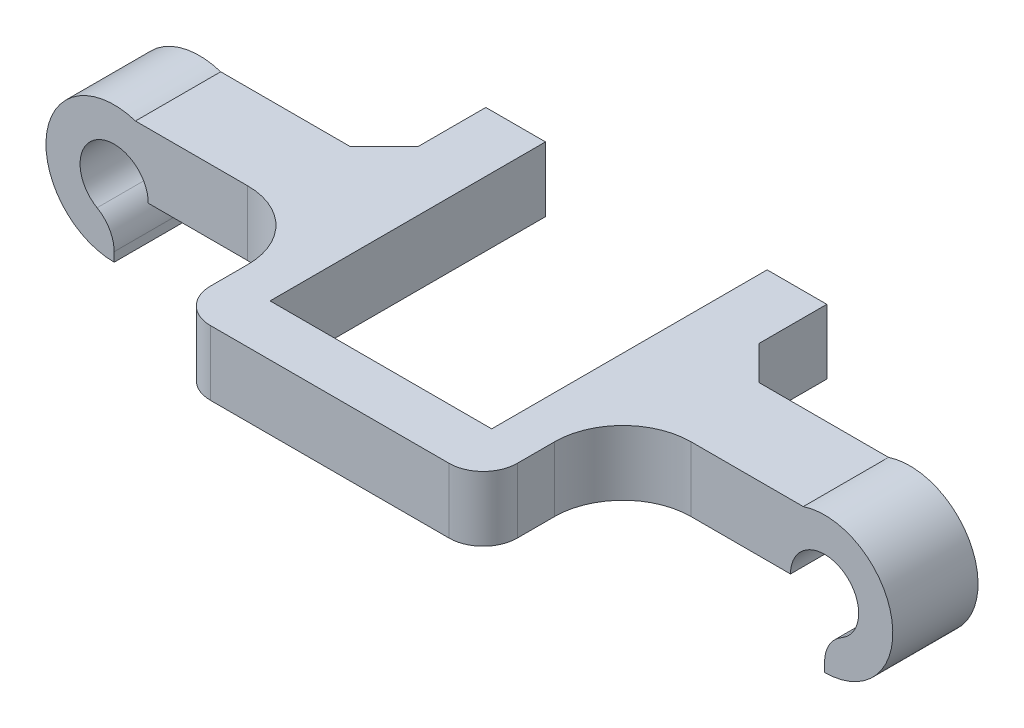
ISO-10303-21;
HEADER;
FILE_DESCRIPTION(('STEP AP214'),'2;1');
FILE_NAME('part.step','',(''),(''),'','','');
FILE_SCHEMA(('AUTOMOTIVE_DESIGN { 1 0 10303 214 1 1 1 1 }'));
ENDSEC;
DATA;
#1=APPLICATION_CONTEXT('core data for automotive mechanical design processes');
#2=APPLICATION_PROTOCOL_DEFINITION('international standard','automotive_design',2000,#1);
#3=PRODUCT_CONTEXT('',#1,'mechanical');
#4=PRODUCT('Part','Part','',(#3));
#5=PRODUCT_RELATED_PRODUCT_CATEGORY('part','',(#4));
#6=PRODUCT_DEFINITION_FORMATION('','',#4);
#7=PRODUCT_DEFINITION_CONTEXT('part definition',#1,'design');
#8=PRODUCT_DEFINITION('design','',#6,#7);
#9=PRODUCT_DEFINITION_SHAPE('','',#8);
#10=(LENGTH_UNIT() NAMED_UNIT(*) SI_UNIT(.MILLI.,.METRE.));
#11=(NAMED_UNIT(*) PLANE_ANGLE_UNIT() SI_UNIT($,.RADIAN.));
#12=(NAMED_UNIT(*) SI_UNIT($,.STERADIAN.) SOLID_ANGLE_UNIT());
#13=UNCERTAINTY_MEASURE_WITH_UNIT(LENGTH_MEASURE(1.E-05),#10,'distance_accuracy_value','');
#14=(GEOMETRIC_REPRESENTATION_CONTEXT(3) GLOBAL_UNCERTAINTY_ASSIGNED_CONTEXT((#13)) GLOBAL_UNIT_ASSIGNED_CONTEXT((#10,
#11,#12)) REPRESENTATION_CONTEXT('',''));
#15=CARTESIAN_POINT('',(0.,0.,0.));
#16=DIRECTION('',(0.,0.,1.));
#17=DIRECTION('',(1.,0.,0.));
#18=AXIS2_PLACEMENT_3D('',#15,#16,#17);
#19=CARTESIAN_POINT('',(72.7520899639895,20.4324888894581,28.));
#20=DIRECTION('',(1.,0.,0.));
#21=DIRECTION('',(0.,0.,-1.));
#22=AXIS2_PLACEMENT_3D('',#19,#20,#21);
#23=PLANE('',#22);
#24=DIRECTION('',(0.,1.,0.));
#25=VECTOR('',#24,1.);
#26=CARTESIAN_POINT('',(72.7520899639895,20.4324888894581,11.6620993138757));
#27=LINE('',#26,#25);
#28=CARTESIAN_POINT('',(72.7520899639895,18.4324888894581,11.6620993138757));
#29=VERTEX_POINT('',#28);
#30=CARTESIAN_POINT('',(72.7520899639895,18.9683872743203,11.6620993138757));
#31=VERTEX_POINT('',#30);
#32=EDGE_CURVE('E310',#29,#31,#27,.T.);
#33=ORIENTED_EDGE('',*,*,#32,.F.);
#34=DIRECTION('',(0.,0.,-1.));
#35=VECTOR('',#34,1.);
#36=CARTESIAN_POINT('',(72.7520899639895,18.4324888894581,28.));
#37=LINE('',#36,#35);
#38=CARTESIAN_POINT('',(72.7520899639895,18.4324888894581,16.6620993138757));
#39=VERTEX_POINT('',#38);
#40=EDGE_CURVE('E345',#39,#29,#37,.T.);
#41=ORIENTED_EDGE('',*,*,#40,.F.);
#42=DIRECTION('',(0.,-1.,0.));
#43=VECTOR('',#42,1.);
#44=CARTESIAN_POINT('',(72.7520899639895,20.4324888894581,16.6620993138757));
#45=LINE('',#44,#43);
#46=CARTESIAN_POINT('',(72.7520899639895,18.9683872743203,16.6620993138757));
#47=VERTEX_POINT('',#46);
#48=EDGE_CURVE('E297',#47,#39,#45,.T.);
#49=ORIENTED_EDGE('',*,*,#48,.F.);
#50=DIRECTION('',(0.,0.,-1.));
#51=VECTOR('',#50,1.);
#52=CARTESIAN_POINT('',(72.7520899639895,18.9683872743203,28.));
#53=LINE('',#52,#51);
#54=EDGE_CURVE('E348',#47,#31,#53,.T.);
#55=ORIENTED_EDGE('',*,*,#54,.T.);
#56=EDGE_LOOP('',(#33,#41,#49,#55));
#57=FACE_BOUND('',#56,.T.);
#58=ADVANCED_FACE('F36',(#57),#23,.F.);
#59=CARTESIAN_POINT('',(72.7520899639895,22.4324888894581,28.));
#60=DIRECTION('',(0.,0.,-1.));
#61=DIRECTION('',(-1.,0.,0.));
#62=AXIS2_PLACEMENT_3D('',#59,#60,#61);
#63=CYLINDRICAL_SURFACE('',#62,4.);
#64=ORIENTED_EDGE('',*,*,#40,.T.);
#65=CARTESIAN_POINT('',(72.7520899639895,22.4324888894581,11.6620993138757));
#66=DIRECTION('',(0.,0.,-1.));
#67=DIRECTION('',(-1.,0.,0.));
#68=AXIS2_PLACEMENT_3D('',#65,#66,#67);
#69=CIRCLE('',#68,4.);
#70=CARTESIAN_POINT('',(71.5030903642794,26.2324888894481,11.6620993138757));
#71=VERTEX_POINT('',#70);
#72=EDGE_CURVE('E312',#71,#29,#69,.T.);
#73=ORIENTED_EDGE('',*,*,#72,.F.);
#74=DIRECTION('',(0.,0.,-1.));
#75=VECTOR('',#74,1.);
#76=CARTESIAN_POINT('',(71.5030903643098,26.2324888894581,28.));
#77=LINE('',#76,#75);
#78=CARTESIAN_POINT('',(71.5030903642794,26.2324888894481,16.6620993138757));
#79=VERTEX_POINT('',#78);
#80=EDGE_CURVE('E333',#71,#79,#77,.F.);
#81=ORIENTED_EDGE('',*,*,#80,.T.);
#82=CARTESIAN_POINT('',(72.7520899639895,22.4324888894581,16.6620993138757));
#83=DIRECTION('',(0.,0.,1.));
#84=DIRECTION('',(1.,0.,0.));
#85=AXIS2_PLACEMENT_3D('',#82,#83,#84);
#86=CIRCLE('',#85,4.);
#87=EDGE_CURVE('E300',#39,#79,#86,.T.);
#88=ORIENTED_EDGE('',*,*,#87,.F.);
#89=EDGE_LOOP('',(#64,#73,#81,#88));
#90=FACE_BOUND('',#89,.T.);
#91=ADVANCED_FACE('F455',(#90),#63,.T.);
#92=CARTESIAN_POINT('',(31.0820899639895,22.4324888894581,28.));
#93=DIRECTION('',(0.,0.,-1.));
#94=DIRECTION('',(-1.,0.,0.));
#95=AXIS2_PLACEMENT_3D('',#92,#93,#94);
#96=CYLINDRICAL_SURFACE('',#95,4.00000000000001);
#97=DIRECTION('',(0.,0.,-1.));
#98=VECTOR('',#97,1.);
#99=CARTESIAN_POINT('',(31.0820899639895,18.4324888894581,28.));
#100=LINE('',#99,#98);
#101=CARTESIAN_POINT('',(31.0820899639895,18.4324888894581,16.6620993138757));
#102=VERTEX_POINT('',#101);
#103=CARTESIAN_POINT('',(31.0820899639895,18.4324888894581,11.6620993138757));
#104=VERTEX_POINT('',#103);
#105=EDGE_CURVE('E342',#102,#104,#100,.T.);
#106=ORIENTED_EDGE('',*,*,#105,.F.);
#107=CARTESIAN_POINT('',(31.0820899639895,22.4324888894581,16.6620993138757));
#108=DIRECTION('',(0.,0.,1.));
#109=DIRECTION('',(1.,0.,0.));
#110=AXIS2_PLACEMENT_3D('',#107,#108,#109);
#111=CIRCLE('',#110,4.00000000000001);
#112=CARTESIAN_POINT('',(32.3310895636692,26.2324888894581,16.6620993138757));
#113=VERTEX_POINT('',#112);
#114=EDGE_CURVE('E286',#113,#102,#111,.T.);
#115=ORIENTED_EDGE('',*,*,#114,.F.);
#116=DIRECTION('',(0.,0.,-1.));
#117=VECTOR('',#116,1.);
#118=CARTESIAN_POINT('',(32.3310895636692,26.2324888894581,28.));
#119=LINE('',#118,#117);
#120=CARTESIAN_POINT('',(32.3310895636692,26.2324888894581,11.6620993138757));
#121=VERTEX_POINT('',#120);
#122=EDGE_CURVE('E330',#113,#121,#119,.T.);
#123=ORIENTED_EDGE('',*,*,#122,.T.);
#124=CARTESIAN_POINT('',(31.0820899639895,22.4324888894581,11.6620993138757));
#125=DIRECTION('',(0.,0.,-1.));
#126=DIRECTION('',(-1.,0.,0.));
#127=AXIS2_PLACEMENT_3D('',#124,#125,#126);
#128=CIRCLE('',#127,4.00000000000001);
#129=EDGE_CURVE('E274',#104,#121,#128,.T.);
#130=ORIENTED_EDGE('',*,*,#129,.F.);
#131=EDGE_LOOP('',(#106,#115,#123,#130));
#132=FACE_BOUND('',#131,.T.);
#133=ADVANCED_FACE('F461',(#132),#96,.T.);
#134=CARTESIAN_POINT('',(31.0820899639895,20.4324888894581,28.));
#135=DIRECTION('',(-1.,0.,0.));
#136=DIRECTION('',(0.,0.,1.));
#137=AXIS2_PLACEMENT_3D('',#134,#135,#136);
#138=PLANE('',#137);
#139=DIRECTION('',(0.,1.,0.));
#140=VECTOR('',#139,1.);
#141=CARTESIAN_POINT('',(31.0820899639895,20.4324888894581,16.6620993138757));
#142=LINE('',#141,#140);
#143=CARTESIAN_POINT('',(31.0820899639895,18.9683872743204,16.6620993138757));
#144=VERTEX_POINT('',#143);
#145=EDGE_CURVE('E283',#102,#144,#142,.T.);
#146=ORIENTED_EDGE('',*,*,#145,.F.);
#147=ORIENTED_EDGE('',*,*,#105,.T.);
#148=DIRECTION('',(0.,-1.,0.));
#149=VECTOR('',#148,1.);
#150=CARTESIAN_POINT('',(31.0820899639895,20.4324888894581,11.6620993138757));
#151=LINE('',#150,#149);
#152=CARTESIAN_POINT('',(31.0820899639895,18.9683872743204,11.6620993138757));
#153=VERTEX_POINT('',#152);
#154=EDGE_CURVE('E271',#153,#104,#151,.T.);
#155=ORIENTED_EDGE('',*,*,#154,.F.);
#156=DIRECTION('',(0.,0.,-1.));
#157=VECTOR('',#156,1.);
#158=CARTESIAN_POINT('',(31.0820899639895,18.9683872743204,28.));
#159=LINE('',#158,#157);
#160=EDGE_CURVE('E357',#153,#144,#159,.F.);
#161=ORIENTED_EDGE('',*,*,#160,.T.);
#162=EDGE_LOOP('',(#146,#147,#155,#161));
#163=FACE_BOUND('',#162,.T.);
#164=ADVANCED_FACE('F522',(#163),#138,.F.);
#165=CARTESIAN_POINT('',(31.0820899639895,22.4324888894581,28.));
#166=DIRECTION('',(0.,0.,-1.));
#167=DIRECTION('',(-1.,0.,0.));
#168=AXIS2_PLACEMENT_3D('',#165,#166,#167);
#169=CYLINDRICAL_SURFACE('',#168,2.);
#170=CARTESIAN_POINT('',(31.0820899639895,22.4324888894581,16.6620993138757));
#171=DIRECTION('',(0.,0.,1.));
#172=DIRECTION('',(1.,0.,0.));
#173=AXIS2_PLACEMENT_3D('',#170,#171,#172);
#174=CIRCLE('',#173,2.);
#175=CARTESIAN_POINT('',(30.0820899639895,20.7004380818892,16.6620993138757));
#176=VERTEX_POINT('',#175);
#177=CARTESIAN_POINT('',(33.0820899639895,22.4324888894581,16.6620993138757));
#178=VERTEX_POINT('',#177);
#179=EDGE_CURVE('E281',#176,#178,#174,.F.);
#180=ORIENTED_EDGE('',*,*,#179,.F.);
#181=DIRECTION('',(0.,0.,-1.));
#182=VECTOR('',#181,1.);
#183=CARTESIAN_POINT('',(30.0820899639895,20.7004380818892,28.));
#184=LINE('',#183,#182);
#185=CARTESIAN_POINT('',(30.0820899639895,20.7004380818892,11.6620993138757));
#186=VERTEX_POINT('',#185);
#187=EDGE_CURVE('E354',#176,#186,#184,.T.);
#188=ORIENTED_EDGE('',*,*,#187,.T.);
#189=CARTESIAN_POINT('',(31.0820899639895,22.4324888894581,11.6620993138757));
#190=DIRECTION('',(0.,0.,-1.));
#191=DIRECTION('',(-1.,0.,0.));
#192=AXIS2_PLACEMENT_3D('',#189,#190,#191);
#193=CIRCLE('',#192,2.);
#194=CARTESIAN_POINT('',(33.0820899639895,22.4324888894581,11.6620993138757));
#195=VERTEX_POINT('',#194);
#196=EDGE_CURVE('E267',#195,#186,#193,.F.);
#197=ORIENTED_EDGE('',*,*,#196,.F.);
#198=DIRECTION('',(0.,0.,-1.));
#199=VECTOR('',#198,1.);
#200=CARTESIAN_POINT('',(33.0820899639895,22.4324888894581,28.));
#201=LINE('',#200,#199);
#202=EDGE_CURVE('E339',#178,#195,#201,.T.);
#203=ORIENTED_EDGE('',*,*,#202,.F.);
#204=EDGE_LOOP('',(#180,#188,#197,#203));
#205=FACE_BOUND('',#204,.T.);
#206=ADVANCED_FACE('F516',(#205),#169,.F.);
#207=CARTESIAN_POINT('',(70.7520899639895,22.4324888894581,28.));
#208=DIRECTION('',(0.,1.,0.));
#209=DIRECTION('',(-1.,0.,0.));
#210=AXIS2_PLACEMENT_3D('',#207,#208,#209);
#211=PLANE('',#210);
#212=DIRECTION('',(0.,0.,-1.));
#213=VECTOR('',#212,1.);
#214=CARTESIAN_POINT('',(60.9170899639558,22.4324888894581,28.));
#215=LINE('',#214,#213);
#216=CARTESIAN_POINT('',(60.9170899639558,22.4324888894581,22.852562097239));
#217=VERTEX_POINT('',#216);
#218=CARTESIAN_POINT('',(60.9170899639558,22.4324888894581,20.6620993138757));
#219=VERTEX_POINT('',#218);
#220=EDGE_CURVE('E326',#217,#219,#215,.T.);
#221=ORIENTED_EDGE('',*,*,#220,.F.);
#222=CARTESIAN_POINT('',(58.9170899639558,22.4324888894581,22.852562097239));
#223=DIRECTION('',(0.,1.,0.));
#224=DIRECTION('',(-1.,0.,0.));
#225=AXIS2_PLACEMENT_3D('',#222,#223,#224);
#226=CIRCLE('',#225,2.);
#227=CARTESIAN_POINT('',(58.9170899639558,22.4324888894581,24.852562097239));
#228=VERTEX_POINT('',#227);
#229=EDGE_CURVE('E418',#217,#228,#226,.F.);
#230=ORIENTED_EDGE('',*,*,#229,.T.);
#231=DIRECTION('',(1.,0.,0.));
#232=VECTOR('',#231,1.);
#233=CARTESIAN_POINT('',(70.7520899639895,22.4324888894581,24.852562097239));
#234=LINE('',#233,#232);
#235=CARTESIAN_POINT('',(44.9170899639558,22.4324888894581,24.852562097239));
#236=VERTEX_POINT('',#235);
#237=EDGE_CURVE('E323',#236,#228,#234,.T.);
#238=ORIENTED_EDGE('',*,*,#237,.F.);
#239=CARTESIAN_POINT('',(44.9170899639558,22.4324888894581,22.852562097239));
#240=DIRECTION('',(0.,1.,0.));
#241=DIRECTION('',(-1.,0.,0.));
#242=AXIS2_PLACEMENT_3D('',#239,#240,#241);
#243=CIRCLE('',#242,2.);
#244=CARTESIAN_POINT('',(42.9170899639558,22.4324888894581,22.852562097239));
#245=VERTEX_POINT('',#244);
#246=EDGE_CURVE('E416',#236,#245,#243,.F.);
#247=ORIENTED_EDGE('',*,*,#246,.T.);
#248=DIRECTION('',(0.,0.,1.));
#249=VECTOR('',#248,1.);
#250=CARTESIAN_POINT('',(42.9170899639558,22.4324888894581,28.));
#251=LINE('',#250,#249);
#252=CARTESIAN_POINT('',(42.9170899639558,22.4324888894581,20.6620993138757));
#253=VERTEX_POINT('',#252);
#254=EDGE_CURVE('E320',#253,#245,#251,.T.);
#255=ORIENTED_EDGE('',*,*,#254,.F.);
#256=CARTESIAN_POINT('',(38.9170899639558,22.4324888894581,20.6620993138757));
#257=DIRECTION('',(0.,1.,0.));
#258=DIRECTION('',(-1.,0.,0.));
#259=AXIS2_PLACEMENT_3D('',#256,#257,#258);
#260=CIRCLE('',#259,4.);
#261=CARTESIAN_POINT('',(38.9170899639558,22.4324888894581,16.6620993138757));
#262=VERTEX_POINT('',#261);
#263=EDGE_CURVE('E403',#253,#262,#260,.T.);
#264=ORIENTED_EDGE('',*,*,#263,.T.);
#265=DIRECTION('',(1.,0.,0.));
#266=VECTOR('',#265,1.);
#267=CARTESIAN_POINT('',(70.7520899639895,22.4324888894581,16.6620993138757));
#268=LINE('',#267,#266);
#269=EDGE_CURVE('E285',#178,#262,#268,.T.);
#270=ORIENTED_EDGE('',*,*,#269,.F.);
#271=ORIENTED_EDGE('',*,*,#202,.T.);
#272=DIRECTION('',(-1.,0.,0.));
#273=VECTOR('',#272,1.);
#274=CARTESIAN_POINT('',(70.7520899639895,22.4324888894581,11.6620993138757));
#275=LINE('',#274,#273);
#276=CARTESIAN_POINT('',(39.9170899639558,22.4324888894581,11.6620993138757));
#277=VERTEX_POINT('',#276);
#278=EDGE_CURVE('E279',#277,#195,#275,.T.);
#279=ORIENTED_EDGE('',*,*,#278,.F.);
#280=DIRECTION('',(-0.707106781186544,0.,0.707106781186551));
#281=VECTOR('',#280,1.);
#282=CARTESIAN_POINT('',(47.1656396209103,22.4324888894581,4.41354965692106));
#283=LINE('',#282,#281);
#284=CARTESIAN_POINT('',(41.9170899639558,22.4324888894581,9.66209931387565));
#285=VERTEX_POINT('',#284);
#286=EDGE_CURVE('E12',#277,#285,#283,.F.);
#287=ORIENTED_EDGE('',*,*,#286,.T.);
#288=DIRECTION('',(0.,0.,-1.));
#289=VECTOR('',#288,1.);
#290=CARTESIAN_POINT('',(41.9170899639558,22.4324888894581,11.6620993138757));
#291=LINE('',#290,#289);
#292=CARTESIAN_POINT('',(41.9170899639558,22.4324888894581,5.69807407282635));
#293=VERTEX_POINT('',#292);
#294=EDGE_CURVE('E247',#285,#293,#291,.T.);
#295=ORIENTED_EDGE('',*,*,#294,.T.);
#296=DIRECTION('',(1.,0.,0.));
#297=VECTOR('',#296,1.);
#298=CARTESIAN_POINT('',(45.4170899639558,22.4324888894581,5.69807407282635));
#299=LINE('',#298,#297);
#300=CARTESIAN_POINT('',(45.4170899639558,22.4324888894581,5.69807407282635));
#301=VERTEX_POINT('',#300);
#302=EDGE_CURVE('E249',#293,#301,#299,.T.);
#303=ORIENTED_EDGE('',*,*,#302,.T.);
#304=DIRECTION('',(0.,0.,-1.));
#305=VECTOR('',#304,1.);
#306=CARTESIAN_POINT('',(45.4170899639558,22.4324888894581,28.));
#307=LINE('',#306,#305);
#308=CARTESIAN_POINT('',(45.4170899639558,22.4324888894581,21.852562097239));
#309=VERTEX_POINT('',#308);
#310=EDGE_CURVE('E318',#309,#301,#307,.T.);
#311=ORIENTED_EDGE('',*,*,#310,.F.);
#312=DIRECTION('',(-1.,0.,0.));
#313=VECTOR('',#312,1.);
#314=CARTESIAN_POINT('',(70.7520899639895,22.4324888894581,21.852562097239));
#315=LINE('',#314,#313);
#316=CARTESIAN_POINT('',(58.4170899639558,22.4324888894581,21.852562097239));
#317=VERTEX_POINT('',#316);
#318=EDGE_CURVE('E316',#317,#309,#315,.T.);
#319=ORIENTED_EDGE('',*,*,#318,.F.);
#320=DIRECTION('',(0.,0.,1.));
#321=VECTOR('',#320,1.);
#322=CARTESIAN_POINT('',(58.4170899639558,22.4324888894581,28.));
#323=LINE('',#322,#321);
#324=CARTESIAN_POINT('',(58.4170899639558,22.4324888894581,5.69807407282635));
#325=VERTEX_POINT('',#324);
#326=EDGE_CURVE('E328',#325,#317,#323,.T.);
#327=ORIENTED_EDGE('',*,*,#326,.F.);
#328=DIRECTION('',(1.,0.,0.));
#329=VECTOR('',#328,1.);
#330=CARTESIAN_POINT('',(58.4170899639558,22.4324888894581,5.69807407282635));
#331=LINE('',#330,#329);
#332=CARTESIAN_POINT('',(61.9170899639558,22.4324888894581,5.69807407282635));
#333=VERTEX_POINT('',#332);
#334=EDGE_CURVE('E255',#325,#333,#331,.T.);
#335=ORIENTED_EDGE('',*,*,#334,.T.);
#336=DIRECTION('',(0.,0.,1.));
#337=VECTOR('',#336,1.);
#338=CARTESIAN_POINT('',(61.9170899639558,22.4324888894581,11.6620993138757));
#339=LINE('',#338,#337);
#340=CARTESIAN_POINT('',(61.9170899639558,22.4324888894581,9.66209931387566));
#341=VERTEX_POINT('',#340);
#342=EDGE_CURVE('E235',#333,#341,#339,.T.);
#343=ORIENTED_EDGE('',*,*,#342,.T.);
#344=DIRECTION('',(-0.70710678118655,0.,-0.707106781186545));
#345=VECTOR('',#344,1.);
#346=CARTESIAN_POINT('',(75.5035403070348,22.4324888894581,23.2485496569546));
#347=LINE('',#346,#345);
#348=CARTESIAN_POINT('',(63.9170899639558,22.4324888894581,11.6620993138757));
#349=VERTEX_POINT('',#348);
#350=EDGE_CURVE('E433',#341,#349,#347,.F.);
#351=ORIENTED_EDGE('',*,*,#350,.T.);
#352=DIRECTION('',(-1.,0.,0.));
#353=VECTOR('',#352,1.);
#354=CARTESIAN_POINT('',(70.7520899639895,22.4324888894581,11.6620993138757));
#355=LINE('',#354,#353);
#356=CARTESIAN_POINT('',(70.7520899639895,22.4324888894581,11.6620993138757));
#357=VERTEX_POINT('',#356);
#358=EDGE_CURVE('E307',#357,#349,#355,.T.);
#359=ORIENTED_EDGE('',*,*,#358,.F.);
#360=DIRECTION('',(0.,0.,-1.));
#361=VECTOR('',#360,1.);
#362=CARTESIAN_POINT('',(70.7520899639895,22.4324888894581,28.));
#363=LINE('',#362,#361);
#364=CARTESIAN_POINT('',(70.7520899639895,22.4324888894581,16.6620993138757));
#365=VERTEX_POINT('',#364);
#366=EDGE_CURVE('E336',#365,#357,#363,.T.);
#367=ORIENTED_EDGE('',*,*,#366,.F.);
#368=DIRECTION('',(1.,0.,0.));
#369=VECTOR('',#368,1.);
#370=CARTESIAN_POINT('',(70.7520899639895,22.4324888894581,16.6620993138757));
#371=LINE('',#370,#369);
#372=CARTESIAN_POINT('',(64.9170899639558,22.4324888894581,16.6620993138757));
#373=VERTEX_POINT('',#372);
#374=EDGE_CURVE('E295',#373,#365,#371,.T.);
#375=ORIENTED_EDGE('',*,*,#374,.F.);
#376=CARTESIAN_POINT('',(64.9170899639558,22.4324888894581,20.6620993138757));
#377=DIRECTION('',(0.,1.,0.));
#378=DIRECTION('',(-1.,0.,0.));
#379=AXIS2_PLACEMENT_3D('',#376,#377,#378);
#380=CIRCLE('',#379,4.);
#381=EDGE_CURVE('E398',#373,#219,#380,.T.);
#382=ORIENTED_EDGE('',*,*,#381,.T.);
#383=EDGE_LOOP('',(#221,#230,#238,#247,#255,#264,#270,#271,#279,#287,#295,#303,#311,#319,#327,
#335,#343,#351,#359,#367,#375,#382));
#384=FACE_BOUND('',#383,.T.);
#385=ADVANCED_FACE('F438',(#384),#211,.F.);
#386=CARTESIAN_POINT('',(72.7520899639895,22.4324888894581,28.));
#387=DIRECTION('',(0.,0.,-1.));
#388=DIRECTION('',(-1.,0.,0.));
#389=AXIS2_PLACEMENT_3D('',#386,#387,#388);
#390=CYLINDRICAL_SURFACE('',#389,2.00000000000001);
#391=CARTESIAN_POINT('',(72.7520899639895,22.4324888894581,11.6620993138757));
#392=DIRECTION('',(0.,0.,-1.));
#393=DIRECTION('',(-1.,0.,0.));
#394=AXIS2_PLACEMENT_3D('',#391,#392,#393);
#395=CIRCLE('',#394,2.00000000000001);
#396=CARTESIAN_POINT('',(73.7520899639895,20.7004380818892,11.6620993138757));
#397=VERTEX_POINT('',#396);
#398=EDGE_CURVE('E305',#397,#357,#395,.F.);
#399=ORIENTED_EDGE('',*,*,#398,.F.);
#400=DIRECTION('',(0.,0.,-1.));
#401=VECTOR('',#400,1.);
#402=CARTESIAN_POINT('',(73.7520899639895,20.7004380818892,28.));
#403=LINE('',#402,#401);
#404=CARTESIAN_POINT('',(73.7520899639895,20.7004380818892,16.6620993138757));
#405=VERTEX_POINT('',#404);
#406=EDGE_CURVE('E351',#397,#405,#403,.F.);
#407=ORIENTED_EDGE('',*,*,#406,.T.);
#408=CARTESIAN_POINT('',(72.7520899639895,22.4324888894581,16.6620993138757));
#409=DIRECTION('',(0.,0.,1.));
#410=DIRECTION('',(1.,0.,0.));
#411=AXIS2_PLACEMENT_3D('',#408,#409,#410);
#412=CIRCLE('',#411,2.00000000000001);
#413=EDGE_CURVE('E293',#365,#405,#412,.F.);
#414=ORIENTED_EDGE('',*,*,#413,.F.);
#415=ORIENTED_EDGE('',*,*,#366,.T.);
#416=EDGE_LOOP('',(#399,#407,#414,#415));
#417=FACE_BOUND('',#416,.T.);
#418=ADVANCED_FACE('F564',(#417),#390,.F.);
#419=CARTESIAN_POINT('',(32.3310895636692,26.2324888894581,-39.7462963867862));
#420=DIRECTION('',(0.,1.,0.));
#421=DIRECTION('',(0.,0.,1.));
#422=AXIS2_PLACEMENT_3D('',#419,#420,#421);
#423=PLANE('',#422);
#424=DIRECTION('',(1.,0.,0.));
#425=VECTOR('',#424,1.);
#426=CARTESIAN_POINT('',(32.3310895636692,26.2324888894581,24.852562097239));
#427=LINE('',#426,#425);
#428=CARTESIAN_POINT('',(44.9170899639558,26.2324888894581,24.852562097239));
#429=VERTEX_POINT('',#428);
#430=CARTESIAN_POINT('',(58.9170899639558,26.2324888894581,24.852562097239));
#431=VERTEX_POINT('',#430);
#432=EDGE_CURVE('E382',#429,#431,#427,.T.);
#433=ORIENTED_EDGE('',*,*,#432,.T.);
#434=CARTESIAN_POINT('',(58.9170899639558,26.2324888894581,22.852562097239));
#435=DIRECTION('',(0.,1.,0.));
#436=DIRECTION('',(0.,0.,1.));
#437=AXIS2_PLACEMENT_3D('',#434,#435,#436);
#438=CIRCLE('',#437,2.);
#439=CARTESIAN_POINT('',(60.9170899639558,26.2324888894581,22.852562097239));
#440=VERTEX_POINT('',#439);
#441=EDGE_CURVE('E412',#431,#440,#438,.T.);
#442=ORIENTED_EDGE('',*,*,#441,.T.);
#443=DIRECTION('',(0.,0.,-1.));
#444=VECTOR('',#443,1.);
#445=CARTESIAN_POINT('',(60.9170899639558,26.2324888894581,-39.7462963867862));
#446=LINE('',#445,#444);
#447=CARTESIAN_POINT('',(60.9170899639558,26.2324888894581,20.6620993138757));
#448=VERTEX_POINT('',#447);
#449=EDGE_CURVE('E384',#440,#448,#446,.T.);
#450=ORIENTED_EDGE('',*,*,#449,.T.);
#451=CARTESIAN_POINT('',(64.9170899639558,26.2324888894581,20.6620993138757));
#452=DIRECTION('',(0.,1.,0.));
#453=DIRECTION('',(0.,0.,1.));
#454=AXIS2_PLACEMENT_3D('',#451,#452,#453);
#455=CIRCLE('',#454,4.);
#456=CARTESIAN_POINT('',(64.9170899639558,26.2324888894581,16.6620993138757));
#457=VERTEX_POINT('',#456);
#458=EDGE_CURVE('E396',#448,#457,#455,.F.);
#459=ORIENTED_EDGE('',*,*,#458,.T.);
#460=DIRECTION('',(1.,0.,0.));
#461=VECTOR('',#460,1.);
#462=CARTESIAN_POINT('',(32.3310895636692,26.2324888894581,16.6620993138757));
#463=LINE('',#462,#461);
#464=EDGE_CURVE('E303',#457,#79,#463,.T.);
#465=ORIENTED_EDGE('',*,*,#464,.T.);
#466=ORIENTED_EDGE('',*,*,#80,.F.);
#467=DIRECTION('',(-1.,0.,0.));
#468=VECTOR('',#467,1.);
#469=CARTESIAN_POINT('',(32.3310895636692,26.2324888894581,11.6620993138757));
#470=LINE('',#469,#468);
#471=CARTESIAN_POINT('',(63.9170899639558,26.2324888894581,11.6620993138757));
#472=VERTEX_POINT('',#471);
#473=EDGE_CURVE('E314',#71,#472,#470,.T.);
#474=ORIENTED_EDGE('',*,*,#473,.T.);
#475=DIRECTION('',(0.70710678118655,0.,0.707106781186545));
#476=VECTOR('',#475,1.);
#477=CARTESIAN_POINT('',(63.9170899639558,26.2324888894581,11.6620993138757));
#478=LINE('',#477,#476);
#479=CARTESIAN_POINT('',(61.9170899639558,26.2324888894581,9.66209931387566));
#480=VERTEX_POINT('',#479);
#481=EDGE_CURVE('E226',#472,#480,#478,.F.);
#482=ORIENTED_EDGE('',*,*,#481,.T.);
#483=DIRECTION('',(0.,0.,-1.));
#484=VECTOR('',#483,1.);
#485=CARTESIAN_POINT('',(61.9170899639558,26.2324888894581,11.6620993138757));
#486=LINE('',#485,#484);
#487=CARTESIAN_POINT('',(61.9170899639558,26.2324888894581,5.69807407282635));
#488=VERTEX_POINT('',#487);
#489=EDGE_CURVE('E218',#480,#488,#486,.T.);
#490=ORIENTED_EDGE('',*,*,#489,.T.);
#491=DIRECTION('',(-1.,0.,0.));
#492=VECTOR('',#491,1.);
#493=CARTESIAN_POINT('',(58.4170899639558,26.2324888894581,5.69807407282635));
#494=LINE('',#493,#492);
#495=CARTESIAN_POINT('',(58.4170899639558,26.2324888894581,5.69807407282635));
#496=VERTEX_POINT('',#495);
#497=EDGE_CURVE('E224',#488,#496,#494,.T.);
#498=ORIENTED_EDGE('',*,*,#497,.T.);
#499=DIRECTION('',(0.,0.,1.));
#500=VECTOR('',#499,1.);
#501=CARTESIAN_POINT('',(58.4170899639558,26.2324888894581,-39.7462963867862));
#502=LINE('',#501,#500);
#503=CARTESIAN_POINT('',(58.4170899639558,26.2324888894581,21.852562097239));
#504=VERTEX_POINT('',#503);
#505=EDGE_CURVE('E377',#496,#504,#502,.T.);
#506=ORIENTED_EDGE('',*,*,#505,.T.);
#507=DIRECTION('',(-1.,0.,0.));
#508=VECTOR('',#507,1.);
#509=CARTESIAN_POINT('',(32.3310895636692,26.2324888894581,21.852562097239));
#510=LINE('',#509,#508);
#511=CARTESIAN_POINT('',(45.4170899639558,26.2324888894581,21.852562097239));
#512=VERTEX_POINT('',#511);
#513=EDGE_CURVE('E372',#504,#512,#510,.T.);
#514=ORIENTED_EDGE('',*,*,#513,.T.);
#515=DIRECTION('',(0.,0.,-1.));
#516=VECTOR('',#515,1.);
#517=CARTESIAN_POINT('',(45.4170899639558,26.2324888894581,-39.7462963867862));
#518=LINE('',#517,#516);
#519=CARTESIAN_POINT('',(45.4170899639558,26.2324888894581,5.69807407282635));
#520=VERTEX_POINT('',#519);
#521=EDGE_CURVE('E375',#512,#520,#518,.T.);
#522=ORIENTED_EDGE('',*,*,#521,.T.);
#523=DIRECTION('',(-1.,0.,0.));
#524=VECTOR('',#523,1.);
#525=CARTESIAN_POINT('',(45.4170899639558,26.2324888894581,5.69807407282635));
#526=LINE('',#525,#524);
#527=CARTESIAN_POINT('',(41.9170899639558,26.2324888894581,5.69807407282635));
#528=VERTEX_POINT('',#527);
#529=EDGE_CURVE('E251',#520,#528,#526,.T.);
#530=ORIENTED_EDGE('',*,*,#529,.T.);
#531=DIRECTION('',(0.,0.,1.));
#532=VECTOR('',#531,1.);
#533=CARTESIAN_POINT('',(41.9170899639558,26.2324888894581,11.6620993138757));
#534=LINE('',#533,#532);
#535=CARTESIAN_POINT('',(41.9170899639558,26.2324888894581,9.66209931387565));
#536=VERTEX_POINT('',#535);
#537=EDGE_CURVE('E254',#528,#536,#534,.T.);
#538=ORIENTED_EDGE('',*,*,#537,.T.);
#539=DIRECTION('',(0.707106781186544,0.,-0.707106781186551));
#540=VECTOR('',#539,1.);
#541=CARTESIAN_POINT('',(41.9170899639558,26.2324888894581,9.66209931387565));
#542=LINE('',#541,#540);
#543=CARTESIAN_POINT('',(39.9170899639558,26.2324888894581,11.6620993138757));
#544=VERTEX_POINT('',#543);
#545=EDGE_CURVE('E44',#536,#544,#542,.F.);
#546=ORIENTED_EDGE('',*,*,#545,.T.);
#547=DIRECTION('',(-1.,0.,0.));
#548=VECTOR('',#547,1.);
#549=CARTESIAN_POINT('',(32.3310895636692,26.2324888894581,11.6620993138757));
#550=LINE('',#549,#548);
#551=EDGE_CURVE('E277',#544,#121,#550,.T.);
#552=ORIENTED_EDGE('',*,*,#551,.T.);
#553=ORIENTED_EDGE('',*,*,#122,.F.);
#554=DIRECTION('',(1.,0.,0.));
#555=VECTOR('',#554,1.);
#556=CARTESIAN_POINT('',(32.3310895636692,26.2324888894581,16.6620993138757));
#557=LINE('',#556,#555);
#558=CARTESIAN_POINT('',(38.9170899639558,26.2324888894581,16.6620993138757));
#559=VERTEX_POINT('',#558);
#560=EDGE_CURVE('E288',#113,#559,#557,.T.);
#561=ORIENTED_EDGE('',*,*,#560,.T.);
#562=CARTESIAN_POINT('',(38.9170899639558,26.2324888894581,20.6620993138757));
#563=DIRECTION('',(0.,1.,0.));
#564=DIRECTION('',(0.,0.,1.));
#565=AXIS2_PLACEMENT_3D('',#562,#563,#564);
#566=CIRCLE('',#565,4.);
#567=CARTESIAN_POINT('',(42.9170899639558,26.2324888894581,20.6620993138757));
#568=VERTEX_POINT('',#567);
#569=EDGE_CURVE('E401',#559,#568,#566,.F.);
#570=ORIENTED_EDGE('',*,*,#569,.T.);
#571=DIRECTION('',(0.,0.,1.));
#572=VECTOR('',#571,1.);
#573=CARTESIAN_POINT('',(42.9170899639558,26.2324888894581,-39.7462963867862));
#574=LINE('',#573,#572);
#575=CARTESIAN_POINT('',(42.9170899639558,26.2324888894581,22.852562097239));
#576=VERTEX_POINT('',#575);
#577=EDGE_CURVE('E379',#568,#576,#574,.T.);
#578=ORIENTED_EDGE('',*,*,#577,.T.);
#579=CARTESIAN_POINT('',(44.9170899639558,26.2324888894581,22.852562097239));
#580=DIRECTION('',(0.,1.,0.));
#581=DIRECTION('',(0.,0.,1.));
#582=AXIS2_PLACEMENT_3D('',#579,#580,#581);
#583=CIRCLE('',#582,2.);
#584=EDGE_CURVE('E410',#576,#429,#583,.T.);
#585=ORIENTED_EDGE('',*,*,#584,.T.);
#586=EDGE_LOOP('',(#433,#442,#450,#459,#465,#466,#474,#482,#490,#498,#506,#514,#522,#530,#538,
#546,#552,#553,#561,#570,#578,#585));
#587=FACE_BOUND('',#586,.T.);
#588=ADVANCED_FACE('F221',(#587),#423,.T.);
#589=CARTESIAN_POINT('',(74.7520899639895,18.9683872743203,28.));
#590=DIRECTION('',(0.,0.,-1.));
#591=DIRECTION('',(-1.,0.,0.));
#592=AXIS2_PLACEMENT_3D('',#589,#590,#591);
#593=CYLINDRICAL_SURFACE('',#592,2.);
#594=ORIENTED_EDGE('',*,*,#406,.F.);
#595=CARTESIAN_POINT('',(74.7520899639895,18.9683872743203,11.6620993138757));
#596=DIRECTION('',(0.,0.,-1.));
#597=DIRECTION('',(-1.,0.,0.));
#598=AXIS2_PLACEMENT_3D('',#595,#596,#597);
#599=CIRCLE('',#598,2.);
#600=EDGE_CURVE('E369',#397,#31,#599,.F.);
#601=ORIENTED_EDGE('',*,*,#600,.T.);
#602=ORIENTED_EDGE('',*,*,#54,.F.);
#603=CARTESIAN_POINT('',(74.7520899639895,18.9683872743203,16.6620993138757));
#604=DIRECTION('',(0.,0.,1.));
#605=DIRECTION('',(1.,0.,0.));
#606=AXIS2_PLACEMENT_3D('',#603,#604,#605);
#607=CIRCLE('',#606,2.);
#608=EDGE_CURVE('E366',#47,#405,#607,.F.);
#609=ORIENTED_EDGE('',*,*,#608,.T.);
#610=EDGE_LOOP('',(#594,#601,#602,#609));
#611=FACE_BOUND('',#610,.T.);
#612=ADVANCED_FACE('F467',(#611),#593,.T.);
#613=CARTESIAN_POINT('',(29.0820899639895,18.9683872743204,28.));
#614=DIRECTION('',(0.,0.,-1.));
#615=DIRECTION('',(-1.,0.,0.));
#616=AXIS2_PLACEMENT_3D('',#613,#614,#615);
#617=CYLINDRICAL_SURFACE('',#616,2.);
#618=ORIENTED_EDGE('',*,*,#187,.F.);
#619=CARTESIAN_POINT('',(29.0820899639895,18.9683872743204,16.6620993138757));
#620=DIRECTION('',(0.,0.,1.));
#621=DIRECTION('',(1.,0.,0.));
#622=AXIS2_PLACEMENT_3D('',#619,#620,#621);
#623=CIRCLE('',#622,2.);
#624=EDGE_CURVE('E363',#176,#144,#623,.F.);
#625=ORIENTED_EDGE('',*,*,#624,.T.);
#626=ORIENTED_EDGE('',*,*,#160,.F.);
#627=CARTESIAN_POINT('',(29.0820899639895,18.9683872743204,11.6620993138757));
#628=DIRECTION('',(0.,0.,-1.));
#629=DIRECTION('',(-1.,0.,0.));
#630=AXIS2_PLACEMENT_3D('',#627,#628,#629);
#631=CIRCLE('',#630,2.);
#632=EDGE_CURVE('E360',#153,#186,#631,.F.);
#633=ORIENTED_EDGE('',*,*,#632,.T.);
#634=EDGE_LOOP('',(#618,#625,#626,#633));
#635=FACE_BOUND('',#634,.T.);
#636=ADVANCED_FACE('F470',(#635),#617,.T.);
#637=CARTESIAN_POINT('',(45.4170899639558,18.4324888894581,11.6620993138757));
#638=DIRECTION('',(0.,0.,-1.));
#639=DIRECTION('',(-1.,0.,0.));
#640=AXIS2_PLACEMENT_3D('',#637,#638,#639);
#641=PLANE('',#640);
#642=ORIENTED_EDGE('',*,*,#551,.F.);
#643=DIRECTION('',(0.,-1.,0.));
#644=VECTOR('',#643,1.);
#645=CARTESIAN_POINT('',(39.9170899639558,22.4324888894581,11.6620993138757));
#646=LINE('',#645,#644);
#647=EDGE_CURVE('E57',#544,#277,#646,.T.);
#648=ORIENTED_EDGE('',*,*,#647,.T.);
#649=ORIENTED_EDGE('',*,*,#278,.T.);
#650=ORIENTED_EDGE('',*,*,#196,.T.);
#651=ORIENTED_EDGE('',*,*,#632,.F.);
#652=ORIENTED_EDGE('',*,*,#154,.T.);
#653=ORIENTED_EDGE('',*,*,#129,.T.);
#654=EDGE_LOOP('',(#642,#648,#649,#650,#651,#652,#653));
#655=FACE_BOUND('',#654,.T.);
#656=ADVANCED_FACE('F474',(#655),#641,.T.);
#657=CARTESIAN_POINT('',(58.4170899639558,18.4324888894581,21.852562097239));
#658=DIRECTION('',(0.,0.,-1.));
#659=DIRECTION('',(-1.,0.,0.));
#660=AXIS2_PLACEMENT_3D('',#657,#658,#659);
#661=PLANE('',#660);
#662=ORIENTED_EDGE('',*,*,#318,.T.);
#663=DIRECTION('',(0.,1.,0.));
#664=VECTOR('',#663,1.);
#665=CARTESIAN_POINT('',(45.4170899639558,18.4324888894581,21.852562097239));
#666=LINE('',#665,#664);
#667=EDGE_CURVE('E264',#309,#512,#666,.T.);
#668=ORIENTED_EDGE('',*,*,#667,.T.);
#669=ORIENTED_EDGE('',*,*,#513,.F.);
#670=DIRECTION('',(0.,1.,0.));
#671=VECTOR('',#670,1.);
#672=CARTESIAN_POINT('',(58.4170899639558,18.4324888894581,21.852562097239));
#673=LINE('',#672,#671);
#674=EDGE_CURVE('E263',#317,#504,#673,.T.);
#675=ORIENTED_EDGE('',*,*,#674,.F.);
#676=EDGE_LOOP('',(#662,#668,#669,#675));
#677=FACE_BOUND('',#676,.T.);
#678=ADVANCED_FACE('F542',(#677),#661,.T.);
#679=CARTESIAN_POINT('',(45.4170899639558,18.4324888894581,21.852562097239));
#680=DIRECTION('',(1.,0.,0.));
#681=DIRECTION('',(0.,0.,-1.));
#682=AXIS2_PLACEMENT_3D('',#679,#680,#681);
#683=PLANE('',#682);
#684=ORIENTED_EDGE('',*,*,#310,.T.);
#685=DIRECTION('',(0.,1.,0.));
#686=VECTOR('',#685,1.);
#687=CARTESIAN_POINT('',(45.4170899639558,15.5173173748915,5.69807407282635));
#688=LINE('',#687,#686);
#689=EDGE_CURVE('E257',#301,#520,#688,.T.);
#690=ORIENTED_EDGE('',*,*,#689,.T.);
#691=ORIENTED_EDGE('',*,*,#521,.F.);
#692=ORIENTED_EDGE('',*,*,#667,.F.);
#693=EDGE_LOOP('',(#684,#690,#691,#692));
#694=FACE_BOUND('',#693,.T.);
#695=ADVANCED_FACE('F540',(#694),#683,.T.);
#696=CARTESIAN_POINT('',(58.4170899639558,18.4324888894581,11.6620993138757));
#697=DIRECTION('',(0.,0.,-1.));
#698=DIRECTION('',(-1.,0.,0.));
#699=AXIS2_PLACEMENT_3D('',#696,#697,#698);
#700=PLANE('',#699);
#701=ORIENTED_EDGE('',*,*,#358,.T.);
#702=DIRECTION('',(0.,1.,0.));
#703=VECTOR('',#702,1.);
#704=CARTESIAN_POINT('',(63.9170899639558,26.2324888894581,11.6620993138757));
#705=LINE('',#704,#703);
#706=EDGE_CURVE('E423',#349,#472,#705,.T.);
#707=ORIENTED_EDGE('',*,*,#706,.T.);
#708=ORIENTED_EDGE('',*,*,#473,.F.);
#709=ORIENTED_EDGE('',*,*,#72,.T.);
#710=ORIENTED_EDGE('',*,*,#32,.T.);
#711=ORIENTED_EDGE('',*,*,#600,.F.);
#712=ORIENTED_EDGE('',*,*,#398,.T.);
#713=EDGE_LOOP('',(#701,#707,#708,#709,#710,#711,#712));
#714=FACE_BOUND('',#713,.T.);
#715=ADVANCED_FACE('F443',(#714),#700,.T.);
#716=CARTESIAN_POINT('',(58.4170899639558,18.4324888894581,21.852562097239));
#717=DIRECTION('',(-1.,0.,0.));
#718=DIRECTION('',(0.,0.,1.));
#719=AXIS2_PLACEMENT_3D('',#716,#717,#718);
#720=PLANE('',#719);
#721=ORIENTED_EDGE('',*,*,#326,.T.);
#722=ORIENTED_EDGE('',*,*,#674,.T.);
#723=ORIENTED_EDGE('',*,*,#505,.F.);
#724=DIRECTION('',(0.,1.,0.));
#725=VECTOR('',#724,1.);
#726=CARTESIAN_POINT('',(58.4170899639558,15.5173173748915,5.69807407282635));
#727=LINE('',#726,#725);
#728=EDGE_CURVE('E238',#325,#496,#727,.T.);
#729=ORIENTED_EDGE('',*,*,#728,.F.);
#730=EDGE_LOOP('',(#721,#722,#723,#729));
#731=FACE_BOUND('',#730,.T.);
#732=ADVANCED_FACE('F545',(#731),#720,.T.);
#733=CARTESIAN_POINT('',(60.9170899639558,18.4324888894581,16.6620993138757));
#734=DIRECTION('',(1.,0.,0.));
#735=DIRECTION('',(0.,0.,-1.));
#736=AXIS2_PLACEMENT_3D('',#733,#734,#735);
#737=PLANE('',#736);
#738=ORIENTED_EDGE('',*,*,#449,.F.);
#739=DIRECTION('',(0.,1.,0.));
#740=VECTOR('',#739,1.);
#741=CARTESIAN_POINT('',(60.9170899639558,18.4324888894581,22.852562097239));
#742=LINE('',#741,#740);
#743=EDGE_CURVE('E414',#440,#217,#742,.F.);
#744=ORIENTED_EDGE('',*,*,#743,.T.);
#745=ORIENTED_EDGE('',*,*,#220,.T.);
#746=DIRECTION('',(0.,1.,0.));
#747=VECTOR('',#746,1.);
#748=CARTESIAN_POINT('',(60.9170899639558,26.2324888894581,20.6620993138757));
#749=LINE('',#748,#747);
#750=EDGE_CURVE('E386',#219,#448,#749,.T.);
#751=ORIENTED_EDGE('',*,*,#750,.T.);
#752=EDGE_LOOP('',(#738,#744,#745,#751));
#753=FACE_BOUND('',#752,.T.);
#754=ADVANCED_FACE('F548',(#753),#737,.T.);
#755=CARTESIAN_POINT('',(60.9170899639558,18.4324888894581,24.852562097239));
#756=DIRECTION('',(0.,0.,1.));
#757=DIRECTION('',(1.,0.,0.));
#758=AXIS2_PLACEMENT_3D('',#755,#756,#757);
#759=PLANE('',#758);
#760=ORIENTED_EDGE('',*,*,#237,.T.);
#761=DIRECTION('',(0.,1.,0.));
#762=VECTOR('',#761,1.);
#763=CARTESIAN_POINT('',(58.9170899639558,18.4324888894581,24.852562097239));
#764=LINE('',#763,#762);
#765=EDGE_CURVE('E407',#228,#431,#764,.T.);
#766=ORIENTED_EDGE('',*,*,#765,.T.);
#767=ORIENTED_EDGE('',*,*,#432,.F.);
#768=DIRECTION('',(0.,1.,0.));
#769=VECTOR('',#768,1.);
#770=CARTESIAN_POINT('',(44.9170899639558,18.4324888894581,24.852562097239));
#771=LINE('',#770,#769);
#772=EDGE_CURVE('E405',#429,#236,#771,.F.);
#773=ORIENTED_EDGE('',*,*,#772,.T.);
#774=EDGE_LOOP('',(#760,#766,#767,#773));
#775=FACE_BOUND('',#774,.T.);
#776=ADVANCED_FACE('F554',(#775),#759,.T.);
#777=CARTESIAN_POINT('',(42.9170899639558,18.4324888894581,16.6620993138757));
#778=DIRECTION('',(-1.,0.,0.));
#779=DIRECTION('',(0.,0.,1.));
#780=AXIS2_PLACEMENT_3D('',#777,#778,#779);
#781=PLANE('',#780);
#782=ORIENTED_EDGE('',*,*,#254,.T.);
#783=DIRECTION('',(0.,1.,0.));
#784=VECTOR('',#783,1.);
#785=CARTESIAN_POINT('',(42.9170899639558,18.4324888894581,22.852562097239));
#786=LINE('',#785,#784);
#787=EDGE_CURVE('E420',#245,#576,#786,.T.);
#788=ORIENTED_EDGE('',*,*,#787,.T.);
#789=ORIENTED_EDGE('',*,*,#577,.F.);
#790=DIRECTION('',(0.,1.,0.));
#791=VECTOR('',#790,1.);
#792=CARTESIAN_POINT('',(42.9170899639558,22.4324888894581,20.6620993138757));
#793=LINE('',#792,#791);
#794=EDGE_CURVE('E394',#568,#253,#793,.F.);
#795=ORIENTED_EDGE('',*,*,#794,.T.);
#796=EDGE_LOOP('',(#782,#788,#789,#795));
#797=FACE_BOUND('',#796,.T.);
#798=ADVANCED_FACE('F506',(#797),#781,.T.);
#799=CARTESIAN_POINT('',(83.5710347803569,18.4324888894581,16.6620993138757));
#800=DIRECTION('',(0.,0.,1.));
#801=DIRECTION('',(1.,0.,0.));
#802=AXIS2_PLACEMENT_3D('',#799,#800,#801);
#803=PLANE('',#802);
#804=ORIENTED_EDGE('',*,*,#464,.F.);
#805=DIRECTION('',(0.,1.,0.));
#806=VECTOR('',#805,1.);
#807=CARTESIAN_POINT('',(64.9170899639558,22.4324888894581,16.6620993138757));
#808=LINE('',#807,#806);
#809=EDGE_CURVE('E389',#457,#373,#808,.F.);
#810=ORIENTED_EDGE('',*,*,#809,.T.);
#811=ORIENTED_EDGE('',*,*,#374,.T.);
#812=ORIENTED_EDGE('',*,*,#413,.T.);
#813=ORIENTED_EDGE('',*,*,#608,.F.);
#814=ORIENTED_EDGE('',*,*,#48,.T.);
#815=ORIENTED_EDGE('',*,*,#87,.T.);
#816=EDGE_LOOP('',(#804,#810,#811,#812,#813,#814,#815));
#817=FACE_BOUND('',#816,.T.);
#818=ADVANCED_FACE('F611',(#817),#803,.T.);
#819=CARTESIAN_POINT('',(25.3764115306726,18.4324888894581,16.6620993138757));
#820=DIRECTION('',(0.,0.,1.));
#821=DIRECTION('',(1.,0.,0.));
#822=AXIS2_PLACEMENT_3D('',#819,#820,#821);
#823=PLANE('',#822);
#824=ORIENTED_EDGE('',*,*,#269,.T.);
#825=DIRECTION('',(0.,1.,0.));
#826=VECTOR('',#825,1.);
#827=CARTESIAN_POINT('',(38.9170899639558,26.2324888894581,16.6620993138757));
#828=LINE('',#827,#826);
#829=EDGE_CURVE('E391',#262,#559,#828,.T.);
#830=ORIENTED_EDGE('',*,*,#829,.T.);
#831=ORIENTED_EDGE('',*,*,#560,.F.);
#832=ORIENTED_EDGE('',*,*,#114,.T.);
#833=ORIENTED_EDGE('',*,*,#145,.T.);
#834=ORIENTED_EDGE('',*,*,#624,.F.);
#835=ORIENTED_EDGE('',*,*,#179,.T.);
#836=EDGE_LOOP('',(#824,#830,#831,#832,#833,#834,#835));
#837=FACE_BOUND('',#836,.T.);
#838=ADVANCED_FACE('F480',(#837),#823,.T.);
#839=CARTESIAN_POINT('',(64.9170899639558,18.4324888894581,20.6620993138757));
#840=DIRECTION('',(0.,-1.,0.));
#841=DIRECTION('',(0.,0.,-1.));
#842=AXIS2_PLACEMENT_3D('',#839,#840,#841);
#843=CYLINDRICAL_SURFACE('',#842,4.);
#844=ORIENTED_EDGE('',*,*,#381,.F.);
#845=ORIENTED_EDGE('',*,*,#809,.F.);
#846=ORIENTED_EDGE('',*,*,#458,.F.);
#847=ORIENTED_EDGE('',*,*,#750,.F.);
#848=EDGE_LOOP('',(#844,#845,#846,#847));
#849=FACE_BOUND('',#848,.T.);
#850=ADVANCED_FACE('F476',(#849),#843,.F.);
#851=CARTESIAN_POINT('',(38.9170899639558,18.4324888894581,20.6620993138757));
#852=DIRECTION('',(0.,-1.,0.));
#853=DIRECTION('',(0.,0.,-1.));
#854=AXIS2_PLACEMENT_3D('',#851,#852,#853);
#855=CYLINDRICAL_SURFACE('',#854,4.);
#856=ORIENTED_EDGE('',*,*,#263,.F.);
#857=ORIENTED_EDGE('',*,*,#794,.F.);
#858=ORIENTED_EDGE('',*,*,#569,.F.);
#859=ORIENTED_EDGE('',*,*,#829,.F.);
#860=EDGE_LOOP('',(#856,#857,#858,#859));
#861=FACE_BOUND('',#860,.T.);
#862=ADVANCED_FACE('F479',(#861),#855,.F.);
#863=CARTESIAN_POINT('',(58.9170899639558,18.4324888894581,22.852562097239));
#864=DIRECTION('',(0.,1.,0.));
#865=DIRECTION('',(0.,0.,1.));
#866=AXIS2_PLACEMENT_3D('',#863,#864,#865);
#867=CYLINDRICAL_SURFACE('',#866,2.);
#868=ORIENTED_EDGE('',*,*,#229,.F.);
#869=ORIENTED_EDGE('',*,*,#743,.F.);
#870=ORIENTED_EDGE('',*,*,#441,.F.);
#871=ORIENTED_EDGE('',*,*,#765,.F.);
#872=EDGE_LOOP('',(#868,#869,#870,#871));
#873=FACE_BOUND('',#872,.T.);
#874=ADVANCED_FACE('F484',(#873),#867,.T.);
#875=CARTESIAN_POINT('',(44.9170899639558,18.4324888894581,22.852562097239));
#876=DIRECTION('',(0.,1.,0.));
#877=DIRECTION('',(0.,0.,1.));
#878=AXIS2_PLACEMENT_3D('',#875,#876,#877);
#879=CYLINDRICAL_SURFACE('',#878,2.);
#880=ORIENTED_EDGE('',*,*,#246,.F.);
#881=ORIENTED_EDGE('',*,*,#772,.F.);
#882=ORIENTED_EDGE('',*,*,#584,.F.);
#883=ORIENTED_EDGE('',*,*,#787,.F.);
#884=EDGE_LOOP('',(#880,#881,#882,#883));
#885=FACE_BOUND('',#884,.T.);
#886=ADVANCED_FACE('F487',(#885),#879,.T.);
#887=CARTESIAN_POINT('',(41.9170899639558,15.5173173748915,11.6620993138757));
#888=DIRECTION('',(-1.,0.,0.));
#889=DIRECTION('',(0.,0.,1.));
#890=AXIS2_PLACEMENT_3D('',#887,#888,#889);
#891=PLANE('',#890);
#892=ORIENTED_EDGE('',*,*,#294,.F.);
#893=DIRECTION('',(0.,1.,0.));
#894=VECTOR('',#893,1.);
#895=CARTESIAN_POINT('',(41.9170899639558,26.2324888894581,9.66209931387565));
#896=LINE('',#895,#894);
#897=EDGE_CURVE('E428',#285,#536,#896,.T.);
#898=ORIENTED_EDGE('',*,*,#897,.T.);
#899=ORIENTED_EDGE('',*,*,#537,.F.);
#900=DIRECTION('',(0.,1.,0.));
#901=VECTOR('',#900,1.);
#902=CARTESIAN_POINT('',(41.9170899639558,15.5173173748915,5.69807407282635));
#903=LINE('',#902,#901);
#904=EDGE_CURVE('E250',#293,#528,#903,.T.);
#905=ORIENTED_EDGE('',*,*,#904,.F.);
#906=EDGE_LOOP('',(#892,#898,#899,#905));
#907=FACE_BOUND('',#906,.T.);
#908=ADVANCED_FACE('F490',(#907),#891,.T.);
#909=CARTESIAN_POINT('',(45.4170899639558,15.5173173748915,5.69807407282635));
#910=DIRECTION('',(0.,0.,-1.));
#911=DIRECTION('',(-1.,0.,0.));
#912=AXIS2_PLACEMENT_3D('',#909,#910,#911);
#913=PLANE('',#912);
#914=ORIENTED_EDGE('',*,*,#302,.F.);
#915=ORIENTED_EDGE('',*,*,#904,.T.);
#916=ORIENTED_EDGE('',*,*,#529,.F.);
#917=ORIENTED_EDGE('',*,*,#689,.F.);
#918=EDGE_LOOP('',(#914,#915,#916,#917));
#919=FACE_BOUND('',#918,.T.);
#920=ADVANCED_FACE('F496',(#919),#913,.T.);
#921=CARTESIAN_POINT('',(58.4170899639558,15.5173173748915,5.69807407282635));
#922=DIRECTION('',(0.,0.,-1.));
#923=DIRECTION('',(-1.,0.,0.));
#924=AXIS2_PLACEMENT_3D('',#921,#922,#923);
#925=PLANE('',#924);
#926=ORIENTED_EDGE('',*,*,#334,.F.);
#927=ORIENTED_EDGE('',*,*,#728,.T.);
#928=ORIENTED_EDGE('',*,*,#497,.F.);
#929=DIRECTION('',(0.,1.,0.));
#930=VECTOR('',#929,1.);
#931=CARTESIAN_POINT('',(61.9170899639558,15.5173173748915,5.69807407282635));
#932=LINE('',#931,#930);
#933=EDGE_CURVE('E232',#333,#488,#932,.T.);
#934=ORIENTED_EDGE('',*,*,#933,.F.);
#935=EDGE_LOOP('',(#926,#927,#928,#934));
#936=FACE_BOUND('',#935,.T.);
#937=ADVANCED_FACE('F241',(#936),#925,.T.);
#938=CARTESIAN_POINT('',(61.9170899639558,15.5173173748915,11.6620993138757));
#939=DIRECTION('',(1.,0.,0.));
#940=DIRECTION('',(0.,0.,-1.));
#941=AXIS2_PLACEMENT_3D('',#938,#939,#940);
#942=PLANE('',#941);
#943=ORIENTED_EDGE('',*,*,#489,.F.);
#944=DIRECTION('',(0.,-1.,0.));
#945=VECTOR('',#944,1.);
#946=CARTESIAN_POINT('',(61.9170899639558,22.4324888894581,9.66209931387566));
#947=LINE('',#946,#945);
#948=EDGE_CURVE('E426',#480,#341,#947,.T.);
#949=ORIENTED_EDGE('',*,*,#948,.T.);
#950=ORIENTED_EDGE('',*,*,#342,.F.);
#951=ORIENTED_EDGE('',*,*,#933,.T.);
#952=EDGE_LOOP('',(#943,#949,#950,#951));
#953=FACE_BOUND('',#952,.T.);
#954=ADVANCED_FACE('F233',(#953),#942,.T.);
#955=CARTESIAN_POINT('',(63.9170899639558,18.4324888894581,11.6620993138757));
#956=DIRECTION('',(0.707106781186545,0.,-0.70710678118655));
#957=DIRECTION('',(0.,-1.,0.));
#958=AXIS2_PLACEMENT_3D('',#955,#956,#957);
#959=PLANE('',#958);
#960=ORIENTED_EDGE('',*,*,#350,.F.);
#961=ORIENTED_EDGE('',*,*,#948,.F.);
#962=ORIENTED_EDGE('',*,*,#481,.F.);
#963=ORIENTED_EDGE('',*,*,#706,.F.);
#964=EDGE_LOOP('',(#960,#961,#962,#963));
#965=FACE_BOUND('',#964,.T.);
#966=ADVANCED_FACE('F445',(#965),#959,.T.);
#967=CARTESIAN_POINT('',(41.9170899639558,15.5173173748915,9.66209931387565));
#968=DIRECTION('',(-0.707106781186551,0.,-0.707106781186544));
#969=DIRECTION('',(0.,-1.,0.));
#970=AXIS2_PLACEMENT_3D('',#967,#968,#969);
#971=PLANE('',#970);
#972=ORIENTED_EDGE('',*,*,#286,.F.);
#973=ORIENTED_EDGE('',*,*,#647,.F.);
#974=ORIENTED_EDGE('',*,*,#545,.F.);
#975=ORIENTED_EDGE('',*,*,#897,.F.);
#976=EDGE_LOOP('',(#972,#973,#974,#975));
#977=FACE_BOUND('',#976,.T.);
#978=ADVANCED_FACE('F38',(#977),#971,.T.);
#979=CLOSED_SHELL('',(#58,#91,#133,#164,#206,#385,#418,#588,#612,#636,#656,#678,#695,#715,#732,
#754,#776,#798,#818,#838,#850,#862,#874,#886,#908,#920,#937,#954,#966,#978));
#980=MANIFOLD_SOLID_BREP('B2',#979);
#981=ADVANCED_BREP_SHAPE_REPRESENTATION('',(#18,#980),#14);
#982=SHAPE_DEFINITION_REPRESENTATION(#9,#981);
ENDSEC;
END-ISO-10303-21;
